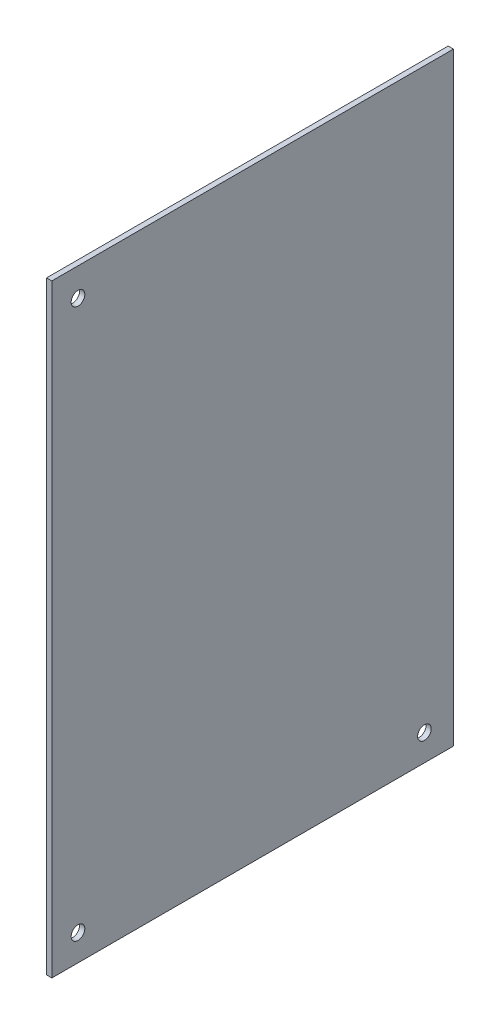
ISO-10303-21;
HEADER;
FILE_DESCRIPTION(('STEP AP214'),'2;1');
FILE_NAME('part.step','',(''),(''),'','','');
FILE_SCHEMA(('AUTOMOTIVE_DESIGN { 1 0 10303 214 1 1 1 1 }'));
ENDSEC;
DATA;
#1=APPLICATION_CONTEXT('core data for automotive mechanical design processes');
#2=APPLICATION_PROTOCOL_DEFINITION('international standard','automotive_design',2000,#1);
#3=PRODUCT_CONTEXT('',#1,'mechanical');
#4=PRODUCT('Part','Part','',(#3));
#5=PRODUCT_RELATED_PRODUCT_CATEGORY('part','',(#4));
#6=PRODUCT_DEFINITION_FORMATION('','',#4);
#7=PRODUCT_DEFINITION_CONTEXT('part definition',#1,'design');
#8=PRODUCT_DEFINITION('design','',#6,#7);
#9=PRODUCT_DEFINITION_SHAPE('','',#8);
#10=(LENGTH_UNIT() NAMED_UNIT(*) SI_UNIT(.MILLI.,.METRE.));
#11=(NAMED_UNIT(*) PLANE_ANGLE_UNIT() SI_UNIT($,.RADIAN.));
#12=(NAMED_UNIT(*) SI_UNIT($,.STERADIAN.) SOLID_ANGLE_UNIT());
#13=UNCERTAINTY_MEASURE_WITH_UNIT(LENGTH_MEASURE(1.E-05),#10,'distance_accuracy_value','');
#14=(GEOMETRIC_REPRESENTATION_CONTEXT(3) GLOBAL_UNCERTAINTY_ASSIGNED_CONTEXT((#13)) GLOBAL_UNIT_ASSIGNED_CONTEXT((#10,
#11,#12)) REPRESENTATION_CONTEXT('',''));
#15=CARTESIAN_POINT('',(0.,0.,0.));
#16=DIRECTION('',(0.,0.,1.));
#17=DIRECTION('',(1.,0.,0.));
#18=AXIS2_PLACEMENT_3D('',#15,#16,#17);
#19=CARTESIAN_POINT('',(2.,-115.,76.5));
#20=DIRECTION('',(0.,0.,-1.));
#21=DIRECTION('',(-1.,0.,0.));
#22=AXIS2_PLACEMENT_3D('',#19,#20,#21);
#23=PLANE('',#22);
#24=DIRECTION('',(0.,-1.,0.));
#25=VECTOR('',#24,1.);
#26=CARTESIAN_POINT('',(0.,-115.,76.5));
#27=LINE('',#26,#25);
#28=CARTESIAN_POINT('',(0.,115.,76.5));
#29=VERTEX_POINT('',#28);
#30=CARTESIAN_POINT('',(0.,-115.,76.5));
#31=VERTEX_POINT('',#30);
#32=EDGE_CURVE('E98',#29,#31,#27,.T.);
#33=ORIENTED_EDGE('',*,*,#32,.T.);
#34=DIRECTION('',(-1.,0.,0.));
#35=VECTOR('',#34,1.);
#36=CARTESIAN_POINT('',(2.,-115.,76.5));
#37=LINE('',#36,#35);
#38=CARTESIAN_POINT('',(2.,-115.,76.5));
#39=VERTEX_POINT('',#38);
#40=EDGE_CURVE('E11',#39,#31,#37,.T.);
#41=ORIENTED_EDGE('',*,*,#40,.F.);
#42=DIRECTION('',(0.,-1.,0.));
#43=VECTOR('',#42,1.);
#44=CARTESIAN_POINT('',(2.,-115.,76.5));
#45=LINE('',#44,#43);
#46=CARTESIAN_POINT('',(2.,115.,76.5));
#47=VERTEX_POINT('',#46);
#48=EDGE_CURVE('E86',#47,#39,#45,.T.);
#49=ORIENTED_EDGE('',*,*,#48,.F.);
#50=DIRECTION('',(-1.,0.,0.));
#51=VECTOR('',#50,1.);
#52=CARTESIAN_POINT('',(2.,115.,76.5));
#53=LINE('',#52,#51);
#54=EDGE_CURVE('E94',#47,#29,#53,.T.);
#55=ORIENTED_EDGE('',*,*,#54,.T.);
#56=EDGE_LOOP('',(#33,#41,#49,#55));
#57=FACE_BOUND('',#56,.T.);
#58=ADVANCED_FACE('F35',(#57),#23,.F.);
#59=CARTESIAN_POINT('',(2.,-115.,-76.5));
#60=DIRECTION('',(0.,1.,0.));
#61=DIRECTION('',(0.,0.,1.));
#62=AXIS2_PLACEMENT_3D('',#59,#60,#61);
#63=PLANE('',#62);
#64=DIRECTION('',(0.,0.,-1.));
#65=VECTOR('',#64,1.);
#66=CARTESIAN_POINT('',(0.,-115.,-76.5));
#67=LINE('',#66,#65);
#68=CARTESIAN_POINT('',(0.,-115.,-76.5));
#69=VERTEX_POINT('',#68);
#70=EDGE_CURVE('E90',#31,#69,#67,.T.);
#71=ORIENTED_EDGE('',*,*,#70,.T.);
#72=DIRECTION('',(-1.,0.,0.));
#73=VECTOR('',#72,1.);
#74=CARTESIAN_POINT('',(2.,-115.,-76.5));
#75=LINE('',#74,#73);
#76=CARTESIAN_POINT('',(2.,-115.,-76.5));
#77=VERTEX_POINT('',#76);
#78=EDGE_CURVE('E43',#77,#69,#75,.T.);
#79=ORIENTED_EDGE('',*,*,#78,.F.);
#80=DIRECTION('',(0.,0.,-1.));
#81=VECTOR('',#80,1.);
#82=CARTESIAN_POINT('',(2.,-115.,-76.5));
#83=LINE('',#82,#81);
#84=EDGE_CURVE('E81',#39,#77,#83,.T.);
#85=ORIENTED_EDGE('',*,*,#84,.F.);
#86=ORIENTED_EDGE('',*,*,#40,.T.);
#87=EDGE_LOOP('',(#71,#79,#85,#86));
#88=FACE_BOUND('',#87,.T.);
#89=ADVANCED_FACE('F89',(#88),#63,.F.);
#90=CARTESIAN_POINT('',(2.,-115.,-76.5));
#91=DIRECTION('',(0.,0.,1.));
#92=DIRECTION('',(1.,0.,0.));
#93=AXIS2_PLACEMENT_3D('',#90,#91,#92);
#94=PLANE('',#93);
#95=DIRECTION('',(0.,1.,0.));
#96=VECTOR('',#95,1.);
#97=CARTESIAN_POINT('',(0.,-115.,-76.5));
#98=LINE('',#97,#96);
#99=CARTESIAN_POINT('',(0.,115.,-76.5));
#100=VERTEX_POINT('',#99);
#101=EDGE_CURVE('E68',#69,#100,#98,.T.);
#102=ORIENTED_EDGE('',*,*,#101,.T.);
#103=DIRECTION('',(-1.,0.,0.));
#104=VECTOR('',#103,1.);
#105=CARTESIAN_POINT('',(2.,115.,-76.5));
#106=LINE('',#105,#104);
#107=CARTESIAN_POINT('',(2.,115.,-76.5));
#108=VERTEX_POINT('',#107);
#109=EDGE_CURVE('E91',#108,#100,#106,.T.);
#110=ORIENTED_EDGE('',*,*,#109,.F.);
#111=DIRECTION('',(0.,1.,0.));
#112=VECTOR('',#111,1.);
#113=CARTESIAN_POINT('',(2.,-115.,-76.5));
#114=LINE('',#113,#112);
#115=EDGE_CURVE('E84',#77,#108,#114,.T.);
#116=ORIENTED_EDGE('',*,*,#115,.F.);
#117=ORIENTED_EDGE('',*,*,#78,.T.);
#118=EDGE_LOOP('',(#102,#110,#116,#117));
#119=FACE_BOUND('',#118,.T.);
#120=ADVANCED_FACE('F92',(#119),#94,.F.);
#121=CARTESIAN_POINT('',(2.,115.,-76.5));
#122=DIRECTION('',(0.,-1.,0.));
#123=DIRECTION('',(0.,0.,-1.));
#124=AXIS2_PLACEMENT_3D('',#121,#122,#123);
#125=PLANE('',#124);
#126=DIRECTION('',(0.,0.,1.));
#127=VECTOR('',#126,1.);
#128=CARTESIAN_POINT('',(0.,115.,-76.5));
#129=LINE('',#128,#127);
#130=EDGE_CURVE('E74',#100,#29,#129,.T.);
#131=ORIENTED_EDGE('',*,*,#130,.T.);
#132=ORIENTED_EDGE('',*,*,#54,.F.);
#133=DIRECTION('',(0.,0.,1.));
#134=VECTOR('',#133,1.);
#135=CARTESIAN_POINT('',(2.,115.,-76.5));
#136=LINE('',#135,#134);
#137=EDGE_CURVE('E51',#108,#47,#136,.T.);
#138=ORIENTED_EDGE('',*,*,#137,.F.);
#139=ORIENTED_EDGE('',*,*,#109,.T.);
#140=EDGE_LOOP('',(#131,#132,#138,#139));
#141=FACE_BOUND('',#140,.T.);
#142=ADVANCED_FACE('F106',(#141),#125,.F.);
#143=CARTESIAN_POINT('',(2.,0.,0.));
#144=DIRECTION('',(1.,0.,0.));
#145=DIRECTION('',(0.,0.,-1.));
#146=AXIS2_PLACEMENT_3D('',#143,#144,#145);
#147=PLANE('',#146);
#148=CARTESIAN_POINT('',(2.,-105.,-65.45));
#149=DIRECTION('',(1.,0.,0.));
#150=DIRECTION('',(0.,0.,-1.));
#151=AXIS2_PLACEMENT_3D('',#148,#149,#150);
#152=CIRCLE('',#151,2.6);
#153=CARTESIAN_POINT('',(2.,-105.,-68.05));
#154=VERTEX_POINT('',#153);
#155=EDGE_CURVE('E124',#154,#154,#152,.T.);
#156=ORIENTED_EDGE('',*,*,#155,.F.);
#157=EDGE_LOOP('',(#156));
#158=FACE_BOUND('',#157,.T.);
#159=CARTESIAN_POINT('',(2.,-105.,66.5308685542101));
#160=DIRECTION('',(1.,0.,0.));
#161=DIRECTION('',(0.,0.,-1.));
#162=AXIS2_PLACEMENT_3D('',#159,#160,#161);
#163=CIRCLE('',#162,2.6);
#164=CARTESIAN_POINT('',(2.,-105.,63.9308685542101));
#165=VERTEX_POINT('',#164);
#166=EDGE_CURVE('E118',#165,#165,#163,.T.);
#167=ORIENTED_EDGE('',*,*,#166,.F.);
#168=EDGE_LOOP('',(#167));
#169=FACE_BOUND('',#168,.T.);
#170=CARTESIAN_POINT('',(2.,104.288337882508,66.5308685542101));
#171=DIRECTION('',(1.,0.,0.));
#172=DIRECTION('',(0.,0.,-1.));
#173=AXIS2_PLACEMENT_3D('',#170,#171,#172);
#174=CIRCLE('',#173,2.6);
#175=CARTESIAN_POINT('',(2.,104.288337882508,63.9308685542101));
#176=VERTEX_POINT('',#175);
#177=EDGE_CURVE('E112',#176,#176,#174,.T.);
#178=ORIENTED_EDGE('',*,*,#177,.F.);
#179=EDGE_LOOP('',(#178));
#180=FACE_BOUND('',#179,.T.);
#181=ORIENTED_EDGE('',*,*,#48,.T.);
#182=ORIENTED_EDGE('',*,*,#84,.T.);
#183=ORIENTED_EDGE('',*,*,#115,.T.);
#184=ORIENTED_EDGE('',*,*,#137,.T.);
#185=EDGE_LOOP('',(#181,#182,#183,#184));
#186=FACE_BOUND('',#185,.T.);
#187=ADVANCED_FACE('F82',(#158,#169,#180,#186),#147,.T.);
#188=CARTESIAN_POINT('',(0.,0.,0.));
#189=DIRECTION('',(1.,0.,0.));
#190=DIRECTION('',(0.,0.,-1.));
#191=AXIS2_PLACEMENT_3D('',#188,#189,#190);
#192=PLANE('',#191);
#193=CARTESIAN_POINT('',(0.,-105.,-65.45));
#194=DIRECTION('',(1.,0.,0.));
#195=DIRECTION('',(0.,0.,-1.));
#196=AXIS2_PLACEMENT_3D('',#193,#194,#195);
#197=CIRCLE('',#196,2.6);
#198=CARTESIAN_POINT('',(0.,-105.,-68.05));
#199=VERTEX_POINT('',#198);
#200=EDGE_CURVE('E101',#199,#199,#197,.T.);
#201=ORIENTED_EDGE('',*,*,#200,.T.);
#202=EDGE_LOOP('',(#201));
#203=FACE_BOUND('',#202,.T.);
#204=CARTESIAN_POINT('',(0.,-105.,66.5308685542101));
#205=DIRECTION('',(1.,0.,0.));
#206=DIRECTION('',(0.,0.,-1.));
#207=AXIS2_PLACEMENT_3D('',#204,#205,#206);
#208=CIRCLE('',#207,2.6);
#209=CARTESIAN_POINT('',(0.,-105.,63.9308685542101));
#210=VERTEX_POINT('',#209);
#211=EDGE_CURVE('E121',#210,#210,#208,.T.);
#212=ORIENTED_EDGE('',*,*,#211,.T.);
#213=EDGE_LOOP('',(#212));
#214=FACE_BOUND('',#213,.T.);
#215=CARTESIAN_POINT('',(0.,104.288337882508,66.5308685542101));
#216=DIRECTION('',(1.,0.,0.));
#217=DIRECTION('',(0.,0.,-1.));
#218=AXIS2_PLACEMENT_3D('',#215,#216,#217);
#219=CIRCLE('',#218,2.6);
#220=CARTESIAN_POINT('',(0.,104.288337882508,63.9308685542101));
#221=VERTEX_POINT('',#220);
#222=EDGE_CURVE('E115',#221,#221,#219,.T.);
#223=ORIENTED_EDGE('',*,*,#222,.T.);
#224=EDGE_LOOP('',(#223));
#225=FACE_BOUND('',#224,.T.);
#226=ORIENTED_EDGE('',*,*,#32,.F.);
#227=ORIENTED_EDGE('',*,*,#130,.F.);
#228=ORIENTED_EDGE('',*,*,#101,.F.);
#229=ORIENTED_EDGE('',*,*,#70,.F.);
#230=EDGE_LOOP('',(#226,#227,#228,#229));
#231=FACE_BOUND('',#230,.T.);
#232=ADVANCED_FACE('F109',(#203,#214,#225,#231),#192,.F.);
#233=CARTESIAN_POINT('',(0.,104.288337882508,66.5308685542101));
#234=DIRECTION('',(1.,0.,0.));
#235=DIRECTION('',(0.,0.,-1.));
#236=AXIS2_PLACEMENT_3D('',#233,#234,#235);
#237=CYLINDRICAL_SURFACE('',#236,2.6);
#238=ORIENTED_EDGE('',*,*,#222,.F.);
#239=EDGE_LOOP('',(#238));
#240=FACE_BOUND('',#239,.T.);
#241=ORIENTED_EDGE('',*,*,#177,.T.);
#242=EDGE_LOOP('',(#241));
#243=FACE_BOUND('',#242,.T.);
#244=ADVANCED_FACE('F146',(#240,#243),#237,.F.);
#245=CARTESIAN_POINT('',(0.,-105.,66.5308685542101));
#246=DIRECTION('',(1.,0.,0.));
#247=DIRECTION('',(0.,0.,-1.));
#248=AXIS2_PLACEMENT_3D('',#245,#246,#247);
#249=CYLINDRICAL_SURFACE('',#248,2.6);
#250=ORIENTED_EDGE('',*,*,#211,.F.);
#251=EDGE_LOOP('',(#250));
#252=FACE_BOUND('',#251,.T.);
#253=ORIENTED_EDGE('',*,*,#166,.T.);
#254=EDGE_LOOP('',(#253));
#255=FACE_BOUND('',#254,.T.);
#256=ADVANCED_FACE('F135',(#252,#255),#249,.F.);
#257=CARTESIAN_POINT('',(0.,-105.,-65.45));
#258=DIRECTION('',(1.,0.,0.));
#259=DIRECTION('',(0.,0.,-1.));
#260=AXIS2_PLACEMENT_3D('',#257,#258,#259);
#261=CYLINDRICAL_SURFACE('',#260,2.6);
#262=ORIENTED_EDGE('',*,*,#200,.F.);
#263=EDGE_LOOP('',(#262));
#264=FACE_BOUND('',#263,.T.);
#265=ORIENTED_EDGE('',*,*,#155,.T.);
#266=EDGE_LOOP('',(#265));
#267=FACE_BOUND('',#266,.T.);
#268=ADVANCED_FACE('F132',(#264,#267),#261,.F.);
#269=CLOSED_SHELL('',(#58,#89,#120,#142,#187,#232,#244,#256,#268));
#270=MANIFOLD_SOLID_BREP('B2',#269);
#271=ADVANCED_BREP_SHAPE_REPRESENTATION('',(#18,#270),#14);
#272=SHAPE_DEFINITION_REPRESENTATION(#9,#271);
ENDSEC;
END-ISO-10303-21;
